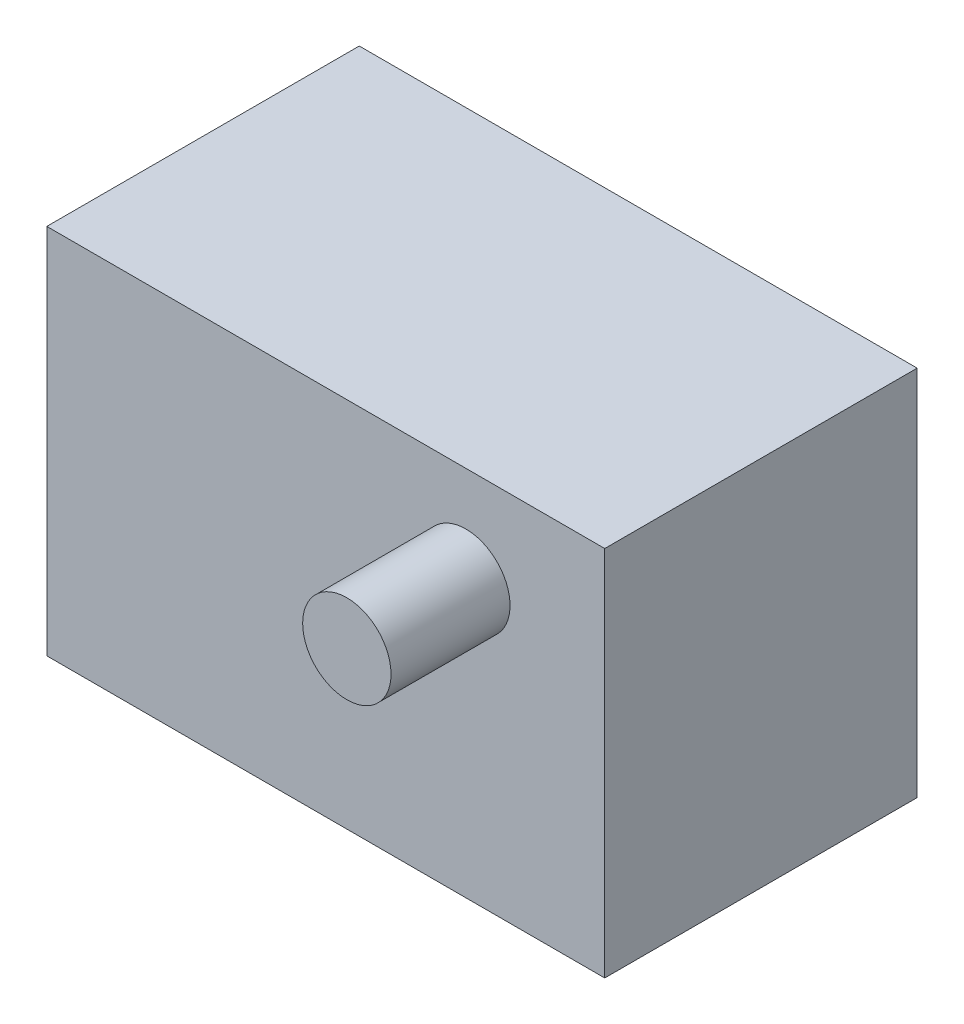
ISO-10303-21;
HEADER;
FILE_DESCRIPTION(('STEP AP214'),'2;1');
FILE_NAME('part.step','',(''),(''),'','','');
FILE_SCHEMA(('AUTOMOTIVE_DESIGN { 1 0 10303 214 1 1 1 1 }'));
ENDSEC;
DATA;
#1=APPLICATION_CONTEXT('core data for automotive mechanical design processes');
#2=APPLICATION_PROTOCOL_DEFINITION('international standard','automotive_design',2000,#1);
#3=PRODUCT_CONTEXT('',#1,'mechanical');
#4=PRODUCT('Part','Part','',(#3));
#5=PRODUCT_RELATED_PRODUCT_CATEGORY('part','',(#4));
#6=PRODUCT_DEFINITION_FORMATION('','',#4);
#7=PRODUCT_DEFINITION_CONTEXT('part definition',#1,'design');
#8=PRODUCT_DEFINITION('design','',#6,#7);
#9=PRODUCT_DEFINITION_SHAPE('','',#8);
#10=(LENGTH_UNIT() NAMED_UNIT(*) SI_UNIT(.MILLI.,.METRE.));
#11=(NAMED_UNIT(*) PLANE_ANGLE_UNIT() SI_UNIT($,.RADIAN.));
#12=(NAMED_UNIT(*) SI_UNIT($,.STERADIAN.) SOLID_ANGLE_UNIT());
#13=UNCERTAINTY_MEASURE_WITH_UNIT(LENGTH_MEASURE(1.E-05),#10,'distance_accuracy_value','');
#14=(GEOMETRIC_REPRESENTATION_CONTEXT(3) GLOBAL_UNCERTAINTY_ASSIGNED_CONTEXT((#13)) GLOBAL_UNIT_ASSIGNED_CONTEXT((#10,
#11,#12)) REPRESENTATION_CONTEXT('',''));
#15=CARTESIAN_POINT('',(0.,0.,0.));
#16=DIRECTION('',(0.,0.,1.));
#17=DIRECTION('',(1.,0.,0.));
#18=AXIS2_PLACEMENT_3D('',#15,#16,#17);
#19=CARTESIAN_POINT('',(-37.5,25.,-42.));
#20=DIRECTION('',(-1.,0.,0.));
#21=DIRECTION('',(0.,0.,1.));
#22=AXIS2_PLACEMENT_3D('',#19,#20,#21);
#23=PLANE('',#22);
#24=DIRECTION('',(0.,-1.,0.));
#25=VECTOR('',#24,1.);
#26=CARTESIAN_POINT('',(-37.5,25.,0.));
#27=LINE('',#26,#25);
#28=CARTESIAN_POINT('',(-37.5,25.,0.));
#29=VERTEX_POINT('',#28);
#30=CARTESIAN_POINT('',(-37.5,-25.,0.));
#31=VERTEX_POINT('',#30);
#32=EDGE_CURVE('E100',#29,#31,#27,.T.);
#33=ORIENTED_EDGE('',*,*,#32,.F.);
#34=DIRECTION('',(0.,0.,1.));
#35=VECTOR('',#34,1.);
#36=CARTESIAN_POINT('',(-37.5,25.,-42.));
#37=LINE('',#36,#35);
#38=CARTESIAN_POINT('',(-37.5,25.,-42.));
#39=VERTEX_POINT('',#38);
#40=EDGE_CURVE('E41',#39,#29,#37,.T.);
#41=ORIENTED_EDGE('',*,*,#40,.F.);
#42=DIRECTION('',(0.,-1.,0.));
#43=VECTOR('',#42,1.);
#44=CARTESIAN_POINT('',(-37.5,25.,-42.));
#45=LINE('',#44,#43);
#46=CARTESIAN_POINT('',(-37.5,-25.,-42.));
#47=VERTEX_POINT('',#46);
#48=EDGE_CURVE('E93',#39,#47,#45,.T.);
#49=ORIENTED_EDGE('',*,*,#48,.T.);
#50=DIRECTION('',(0.,0.,1.));
#51=VECTOR('',#50,1.);
#52=CARTESIAN_POINT('',(-37.5,-25.,-42.));
#53=LINE('',#52,#51);
#54=EDGE_CURVE('E76',#47,#31,#53,.T.);
#55=ORIENTED_EDGE('',*,*,#54,.T.);
#56=EDGE_LOOP('',(#33,#41,#49,#55));
#57=FACE_BOUND('',#56,.T.);
#58=ADVANCED_FACE('F33',(#57),#23,.T.);
#59=CARTESIAN_POINT('',(37.5,25.,-42.));
#60=DIRECTION('',(0.,1.,0.));
#61=DIRECTION('',(-1.,0.,0.));
#62=AXIS2_PLACEMENT_3D('',#59,#60,#61);
#63=PLANE('',#62);
#64=DIRECTION('',(-1.,0.,0.));
#65=VECTOR('',#64,1.);
#66=CARTESIAN_POINT('',(37.5,25.,0.));
#67=LINE('',#66,#65);
#68=CARTESIAN_POINT('',(37.5,25.,0.));
#69=VERTEX_POINT('',#68);
#70=EDGE_CURVE('E95',#69,#29,#67,.T.);
#71=ORIENTED_EDGE('',*,*,#70,.F.);
#72=DIRECTION('',(0.,0.,1.));
#73=VECTOR('',#72,1.);
#74=CARTESIAN_POINT('',(37.5,25.,-42.));
#75=LINE('',#74,#73);
#76=CARTESIAN_POINT('',(37.5,25.,-42.));
#77=VERTEX_POINT('',#76);
#78=EDGE_CURVE('E65',#77,#69,#75,.T.);
#79=ORIENTED_EDGE('',*,*,#78,.F.);
#80=DIRECTION('',(-1.,0.,0.));
#81=VECTOR('',#80,1.);
#82=CARTESIAN_POINT('',(37.5,25.,-42.));
#83=LINE('',#82,#81);
#84=EDGE_CURVE('E90',#77,#39,#83,.T.);
#85=ORIENTED_EDGE('',*,*,#84,.T.);
#86=ORIENTED_EDGE('',*,*,#40,.T.);
#87=EDGE_LOOP('',(#71,#79,#85,#86));
#88=FACE_BOUND('',#87,.T.);
#89=ADVANCED_FACE('F112',(#88),#63,.T.);
#90=CARTESIAN_POINT('',(37.5,25.,-42.));
#91=DIRECTION('',(1.,0.,0.));
#92=DIRECTION('',(0.,1.,0.));
#93=AXIS2_PLACEMENT_3D('',#90,#91,#92);
#94=PLANE('',#93);
#95=DIRECTION('',(0.,1.,0.));
#96=VECTOR('',#95,1.);
#97=CARTESIAN_POINT('',(37.5,25.,0.));
#98=LINE('',#97,#96);
#99=CARTESIAN_POINT('',(37.5,-25.,0.));
#100=VERTEX_POINT('',#99);
#101=EDGE_CURVE('E84',#100,#69,#98,.T.);
#102=ORIENTED_EDGE('',*,*,#101,.F.);
#103=DIRECTION('',(0.,0.,1.));
#104=VECTOR('',#103,1.);
#105=CARTESIAN_POINT('',(37.5,-25.,-42.));
#106=LINE('',#105,#104);
#107=CARTESIAN_POINT('',(37.5,-25.,-42.));
#108=VERTEX_POINT('',#107);
#109=EDGE_CURVE('E79',#108,#100,#106,.T.);
#110=ORIENTED_EDGE('',*,*,#109,.F.);
#111=DIRECTION('',(0.,1.,0.));
#112=VECTOR('',#111,1.);
#113=CARTESIAN_POINT('',(37.5,25.,-42.));
#114=LINE('',#113,#112);
#115=EDGE_CURVE('E82',#108,#77,#114,.T.);
#116=ORIENTED_EDGE('',*,*,#115,.T.);
#117=ORIENTED_EDGE('',*,*,#78,.T.);
#118=EDGE_LOOP('',(#102,#110,#116,#117));
#119=FACE_BOUND('',#118,.T.);
#120=ADVANCED_FACE('F81',(#119),#94,.T.);
#121=CARTESIAN_POINT('',(37.5,-25.,-42.));
#122=DIRECTION('',(0.,-1.,0.));
#123=DIRECTION('',(1.,0.,0.));
#124=AXIS2_PLACEMENT_3D('',#121,#122,#123);
#125=PLANE('',#124);
#126=DIRECTION('',(1.,0.,0.));
#127=VECTOR('',#126,1.);
#128=CARTESIAN_POINT('',(37.5,-25.,0.));
#129=LINE('',#128,#127);
#130=EDGE_CURVE('E103',#31,#100,#129,.T.);
#131=ORIENTED_EDGE('',*,*,#130,.F.);
#132=ORIENTED_EDGE('',*,*,#54,.F.);
#133=DIRECTION('',(1.,0.,0.));
#134=VECTOR('',#133,1.);
#135=CARTESIAN_POINT('',(37.5,-25.,-42.));
#136=LINE('',#135,#134);
#137=EDGE_CURVE('E89',#47,#108,#136,.T.);
#138=ORIENTED_EDGE('',*,*,#137,.T.);
#139=ORIENTED_EDGE('',*,*,#109,.T.);
#140=EDGE_LOOP('',(#131,#132,#138,#139));
#141=FACE_BOUND('',#140,.T.);
#142=ADVANCED_FACE('F92',(#141),#125,.T.);
#143=CARTESIAN_POINT('',(0.,0.,-42.));
#144=DIRECTION('',(0.,0.,-1.));
#145=DIRECTION('',(-1.,0.,0.));
#146=AXIS2_PLACEMENT_3D('',#143,#144,#145);
#147=PLANE('',#146);
#148=ORIENTED_EDGE('',*,*,#48,.F.);
#149=ORIENTED_EDGE('',*,*,#84,.F.);
#150=ORIENTED_EDGE('',*,*,#115,.F.);
#151=ORIENTED_EDGE('',*,*,#137,.F.);
#152=EDGE_LOOP('',(#148,#149,#150,#151));
#153=FACE_BOUND('',#152,.T.);
#154=ADVANCED_FACE('F88',(#153),#147,.T.);
#155=CARTESIAN_POINT('',(0.,0.,0.));
#156=DIRECTION('',(0.,0.,-1.));
#157=DIRECTION('',(-1.,0.,0.));
#158=AXIS2_PLACEMENT_3D('',#155,#156,#157);
#159=PLANE('',#158);
#160=CARTESIAN_POINT('',(18.8306396271767,12.,0.));
#161=DIRECTION('',(0.,0.,-1.));
#162=DIRECTION('',(-1.,0.,0.));
#163=AXIS2_PLACEMENT_3D('',#160,#161,#162);
#164=CIRCLE('',#163,5.93973344092808);
#165=CARTESIAN_POINT('',(12.8909061862486,12.,0.));
#166=VERTEX_POINT('',#165);
#167=EDGE_CURVE('E11',#166,#166,#164,.F.);
#168=ORIENTED_EDGE('',*,*,#167,.F.);
#169=EDGE_LOOP('',(#168));
#170=FACE_BOUND('',#169,.T.);
#171=ORIENTED_EDGE('',*,*,#32,.T.);
#172=ORIENTED_EDGE('',*,*,#130,.T.);
#173=ORIENTED_EDGE('',*,*,#101,.T.);
#174=ORIENTED_EDGE('',*,*,#70,.T.);
#175=EDGE_LOOP('',(#171,#172,#173,#174));
#176=FACE_BOUND('',#175,.T.);
#177=ADVANCED_FACE('F111',(#170,#176),#159,.F.);
#178=CARTESIAN_POINT('',(18.8306396271767,12.,16.));
#179=DIRECTION('',(0.,0.,-1.));
#180=DIRECTION('',(-1.,0.,0.));
#181=AXIS2_PLACEMENT_3D('',#178,#179,#180);
#182=CYLINDRICAL_SURFACE('',#181,5.93973344092808);
#183=CARTESIAN_POINT('',(18.8306396271767,12.,16.));
#184=DIRECTION('',(0.,0.,1.));
#185=DIRECTION('',(1.,0.,0.));
#186=AXIS2_PLACEMENT_3D('',#183,#184,#185);
#187=CIRCLE('',#186,5.93973344092808);
#188=CARTESIAN_POINT('',(24.7703730681047,12.,16.));
#189=VERTEX_POINT('',#188);
#190=EDGE_CURVE('E104',#189,#189,#187,.T.);
#191=ORIENTED_EDGE('',*,*,#190,.F.);
#192=EDGE_LOOP('',(#191));
#193=FACE_BOUND('',#192,.T.);
#194=ORIENTED_EDGE('',*,*,#167,.T.);
#195=EDGE_LOOP('',(#194));
#196=FACE_BOUND('',#195,.T.);
#197=ADVANCED_FACE('F129',(#193,#196),#182,.T.);
#198=CARTESIAN_POINT('',(18.8306396271767,12.,16.));
#199=DIRECTION('',(0.,0.,1.));
#200=DIRECTION('',(1.,0.,0.));
#201=AXIS2_PLACEMENT_3D('',#198,#199,#200);
#202=PLANE('',#201);
#203=ORIENTED_EDGE('',*,*,#190,.T.);
#204=EDGE_LOOP('',(#203));
#205=FACE_BOUND('',#204,.T.);
#206=ADVANCED_FACE('F134',(#205),#202,.T.);
#207=CLOSED_SHELL('',(#58,#89,#120,#142,#154,#177,#197,#206));
#208=MANIFOLD_SOLID_BREP('B2',#207);
#209=ADVANCED_BREP_SHAPE_REPRESENTATION('',(#18,#208),#14);
#210=SHAPE_DEFINITION_REPRESENTATION(#9,#209);
ENDSEC;
END-ISO-10303-21;
